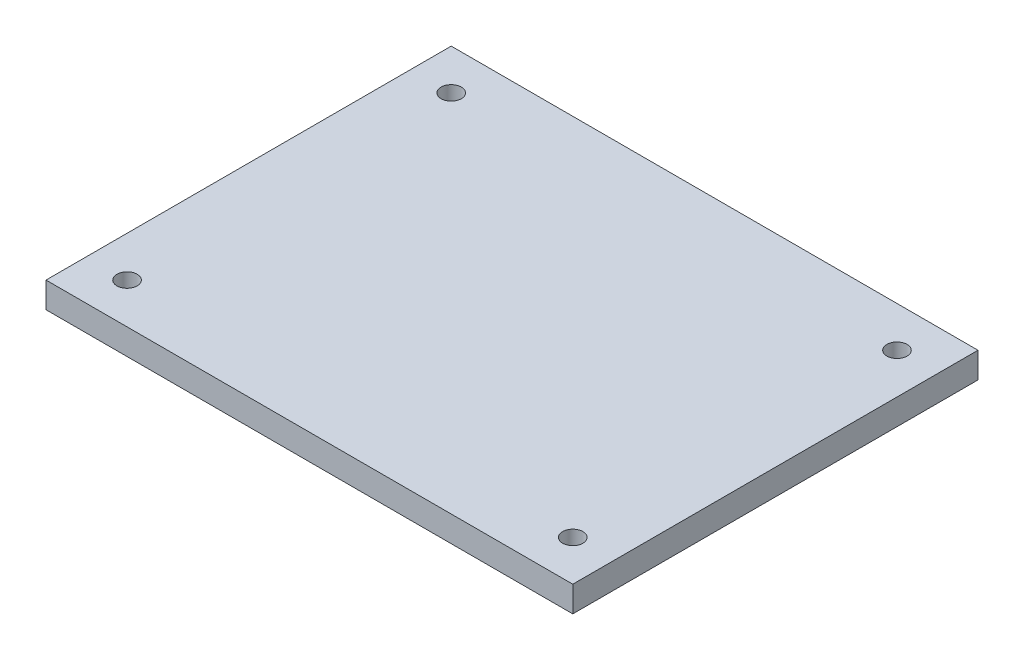
ISO-10303-21;
HEADER;
FILE_DESCRIPTION(('STEP AP214'),'2;1');
FILE_NAME('part.step','',(''),(''),'','','');
FILE_SCHEMA(('AUTOMOTIVE_DESIGN { 1 0 10303 214 1 1 1 1 }'));
ENDSEC;
DATA;
#1=APPLICATION_CONTEXT('core data for automotive mechanical design processes');
#2=APPLICATION_PROTOCOL_DEFINITION('international standard','automotive_design',2000,#1);
#3=PRODUCT_CONTEXT('',#1,'mechanical');
#4=PRODUCT('Part','Part','',(#3));
#5=PRODUCT_RELATED_PRODUCT_CATEGORY('part','',(#4));
#6=PRODUCT_DEFINITION_FORMATION('','',#4);
#7=PRODUCT_DEFINITION_CONTEXT('part definition',#1,'design');
#8=PRODUCT_DEFINITION('design','',#6,#7);
#9=PRODUCT_DEFINITION_SHAPE('','',#8);
#10=(LENGTH_UNIT() NAMED_UNIT(*) SI_UNIT(.MILLI.,.METRE.));
#11=(NAMED_UNIT(*) PLANE_ANGLE_UNIT() SI_UNIT($,.RADIAN.));
#12=(NAMED_UNIT(*) SI_UNIT($,.STERADIAN.) SOLID_ANGLE_UNIT());
#13=UNCERTAINTY_MEASURE_WITH_UNIT(LENGTH_MEASURE(1.E-05),#10,'distance_accuracy_value','');
#14=(GEOMETRIC_REPRESENTATION_CONTEXT(3) GLOBAL_UNCERTAINTY_ASSIGNED_CONTEXT((#13)) GLOBAL_UNIT_ASSIGNED_CONTEXT((#10,
#11,#12)) REPRESENTATION_CONTEXT('',''));
#15=CARTESIAN_POINT('',(0.,0.,0.));
#16=DIRECTION('',(0.,0.,1.));
#17=DIRECTION('',(1.,0.,0.));
#18=AXIS2_PLACEMENT_3D('',#15,#16,#17);
#19=CARTESIAN_POINT('',(0.,3.175,0.));
#20=DIRECTION('',(1.,0.,0.));
#21=DIRECTION('',(0.,0.,-1.));
#22=AXIS2_PLACEMENT_3D('',#19,#20,#21);
#23=PLANE('',#22);
#24=DIRECTION('',(0.,0.,1.));
#25=VECTOR('',#24,1.);
#26=CARTESIAN_POINT('',(0.,0.,0.));
#27=LINE('',#26,#25);
#28=CARTESIAN_POINT('',(0.,0.,-50.));
#29=VERTEX_POINT('',#28);
#30=CARTESIAN_POINT('',(0.,0.,0.));
#31=VERTEX_POINT('',#30);
#32=EDGE_CURVE('E101',#29,#31,#27,.T.);
#33=ORIENTED_EDGE('',*,*,#32,.T.);
#34=DIRECTION('',(0.,-1.,0.));
#35=VECTOR('',#34,1.);
#36=CARTESIAN_POINT('',(0.,3.175,0.));
#37=LINE('',#36,#35);
#38=CARTESIAN_POINT('',(0.,3.175,0.));
#39=VERTEX_POINT('',#38);
#40=EDGE_CURVE('E11',#39,#31,#37,.T.);
#41=ORIENTED_EDGE('',*,*,#40,.F.);
#42=DIRECTION('',(0.,0.,1.));
#43=VECTOR('',#42,1.);
#44=CARTESIAN_POINT('',(0.,3.175,0.));
#45=LINE('',#44,#43);
#46=CARTESIAN_POINT('',(0.,3.175,-50.));
#47=VERTEX_POINT('',#46);
#48=EDGE_CURVE('E88',#47,#39,#45,.T.);
#49=ORIENTED_EDGE('',*,*,#48,.F.);
#50=DIRECTION('',(0.,-1.,0.));
#51=VECTOR('',#50,1.);
#52=CARTESIAN_POINT('',(0.,3.175,-50.));
#53=LINE('',#52,#51);
#54=EDGE_CURVE('E97',#47,#29,#53,.T.);
#55=ORIENTED_EDGE('',*,*,#54,.T.);
#56=EDGE_LOOP('',(#33,#41,#49,#55));
#57=FACE_BOUND('',#56,.T.);
#58=ADVANCED_FACE('F35',(#57),#23,.F.);
#59=CARTESIAN_POINT('',(0.,3.175,0.));
#60=DIRECTION('',(0.,0.,-1.));
#61=DIRECTION('',(-1.,0.,0.));
#62=AXIS2_PLACEMENT_3D('',#59,#60,#61);
#63=PLANE('',#62);
#64=DIRECTION('',(1.,0.,0.));
#65=VECTOR('',#64,1.);
#66=CARTESIAN_POINT('',(0.,0.,0.));
#67=LINE('',#66,#65);
#68=CARTESIAN_POINT('',(65.,0.,0.));
#69=VERTEX_POINT('',#68);
#70=EDGE_CURVE('E92',#31,#69,#67,.T.);
#71=ORIENTED_EDGE('',*,*,#70,.T.);
#72=DIRECTION('',(0.,-1.,0.));
#73=VECTOR('',#72,1.);
#74=CARTESIAN_POINT('',(65.,3.175,0.));
#75=LINE('',#74,#73);
#76=CARTESIAN_POINT('',(65.,3.175,0.));
#77=VERTEX_POINT('',#76);
#78=EDGE_CURVE('E44',#77,#69,#75,.T.);
#79=ORIENTED_EDGE('',*,*,#78,.F.);
#80=DIRECTION('',(1.,0.,0.));
#81=VECTOR('',#80,1.);
#82=CARTESIAN_POINT('',(0.,3.175,0.));
#83=LINE('',#82,#81);
#84=EDGE_CURVE('E83',#39,#77,#83,.T.);
#85=ORIENTED_EDGE('',*,*,#84,.F.);
#86=ORIENTED_EDGE('',*,*,#40,.T.);
#87=EDGE_LOOP('',(#71,#79,#85,#86));
#88=FACE_BOUND('',#87,.T.);
#89=ADVANCED_FACE('F91',(#88),#63,.F.);
#90=CARTESIAN_POINT('',(65.,3.175,0.));
#91=DIRECTION('',(-1.,0.,0.));
#92=DIRECTION('',(0.,0.,1.));
#93=AXIS2_PLACEMENT_3D('',#90,#91,#92);
#94=PLANE('',#93);
#95=DIRECTION('',(0.,0.,-1.));
#96=VECTOR('',#95,1.);
#97=CARTESIAN_POINT('',(65.,0.,0.));
#98=LINE('',#97,#96);
#99=CARTESIAN_POINT('',(65.,0.,-50.));
#100=VERTEX_POINT('',#99);
#101=EDGE_CURVE('E70',#69,#100,#98,.T.);
#102=ORIENTED_EDGE('',*,*,#101,.T.);
#103=DIRECTION('',(0.,-1.,0.));
#104=VECTOR('',#103,1.);
#105=CARTESIAN_POINT('',(65.,3.175,-50.));
#106=LINE('',#105,#104);
#107=CARTESIAN_POINT('',(65.,3.175,-50.));
#108=VERTEX_POINT('',#107);
#109=EDGE_CURVE('E93',#108,#100,#106,.T.);
#110=ORIENTED_EDGE('',*,*,#109,.F.);
#111=DIRECTION('',(0.,0.,-1.));
#112=VECTOR('',#111,1.);
#113=CARTESIAN_POINT('',(65.,3.175,0.));
#114=LINE('',#113,#112);
#115=EDGE_CURVE('E86',#77,#108,#114,.T.);
#116=ORIENTED_EDGE('',*,*,#115,.F.);
#117=ORIENTED_EDGE('',*,*,#78,.T.);
#118=EDGE_LOOP('',(#102,#110,#116,#117));
#119=FACE_BOUND('',#118,.T.);
#120=ADVANCED_FACE('F95',(#119),#94,.F.);
#121=CARTESIAN_POINT('',(0.,3.175,-50.));
#122=DIRECTION('',(0.,0.,1.));
#123=DIRECTION('',(1.,0.,0.));
#124=AXIS2_PLACEMENT_3D('',#121,#122,#123);
#125=PLANE('',#124);
#126=DIRECTION('',(-1.,0.,0.));
#127=VECTOR('',#126,1.);
#128=CARTESIAN_POINT('',(0.,0.,-50.));
#129=LINE('',#128,#127);
#130=EDGE_CURVE('E76',#100,#29,#129,.T.);
#131=ORIENTED_EDGE('',*,*,#130,.T.);
#132=ORIENTED_EDGE('',*,*,#54,.F.);
#133=DIRECTION('',(-1.,0.,0.));
#134=VECTOR('',#133,1.);
#135=CARTESIAN_POINT('',(0.,3.175,-50.));
#136=LINE('',#135,#134);
#137=EDGE_CURVE('E53',#108,#47,#136,.T.);
#138=ORIENTED_EDGE('',*,*,#137,.F.);
#139=ORIENTED_EDGE('',*,*,#109,.T.);
#140=EDGE_LOOP('',(#131,#132,#138,#139));
#141=FACE_BOUND('',#140,.T.);
#142=ADVANCED_FACE('F144',(#141),#125,.F.);
#143=CARTESIAN_POINT('',(0.,3.175,-50.));
#144=DIRECTION('',(0.,-1.,0.));
#145=DIRECTION('',(0.,0.,-1.));
#146=AXIS2_PLACEMENT_3D('',#143,#144,#145);
#147=PLANE('',#146);
#148=CARTESIAN_POINT('',(4.99999999999997,3.175,-45.));
#149=DIRECTION('',(0.,1.,0.));
#150=DIRECTION('',(0.,0.,1.));
#151=AXIS2_PLACEMENT_3D('',#148,#149,#150);
#152=CIRCLE('',#151,1.24999999999999);
#153=CARTESIAN_POINT('',(4.99999999999997,3.175,-43.75));
#154=VERTEX_POINT('',#153);
#155=EDGE_CURVE('E123',#154,#154,#152,.T.);
#156=ORIENTED_EDGE('',*,*,#155,.F.);
#157=EDGE_LOOP('',(#156));
#158=FACE_BOUND('',#157,.T.);
#159=CARTESIAN_POINT('',(60.,3.175,-45.));
#160=DIRECTION('',(0.,1.,0.));
#161=DIRECTION('',(0.,0.,1.));
#162=AXIS2_PLACEMENT_3D('',#159,#160,#161);
#163=CIRCLE('',#162,1.24999999999999);
#164=CARTESIAN_POINT('',(60.,3.175,-43.75));
#165=VERTEX_POINT('',#164);
#166=EDGE_CURVE('E112',#165,#165,#163,.T.);
#167=ORIENTED_EDGE('',*,*,#166,.F.);
#168=EDGE_LOOP('',(#167));
#169=FACE_BOUND('',#168,.T.);
#170=CARTESIAN_POINT('',(60.,3.175,-5.));
#171=DIRECTION('',(0.,1.,0.));
#172=DIRECTION('',(0.,0.,1.));
#173=AXIS2_PLACEMENT_3D('',#170,#171,#172);
#174=CIRCLE('',#173,1.24999999999999);
#175=CARTESIAN_POINT('',(60.,3.175,-3.75000000000001));
#176=VERTEX_POINT('',#175);
#177=EDGE_CURVE('E111',#176,#176,#174,.T.);
#178=ORIENTED_EDGE('',*,*,#177,.F.);
#179=EDGE_LOOP('',(#178));
#180=FACE_BOUND('',#179,.T.);
#181=CARTESIAN_POINT('',(4.99999999999997,3.175,-5.));
#182=DIRECTION('',(0.,1.,0.));
#183=DIRECTION('',(0.,0.,1.));
#184=AXIS2_PLACEMENT_3D('',#181,#182,#183);
#185=CIRCLE('',#184,1.24999999999999);
#186=CARTESIAN_POINT('',(4.99999999999997,3.175,-3.75000000000001));
#187=VERTEX_POINT('',#186);
#188=EDGE_CURVE('E128',#187,#187,#185,.T.);
#189=ORIENTED_EDGE('',*,*,#188,.F.);
#190=EDGE_LOOP('',(#189));
#191=FACE_BOUND('',#190,.T.);
#192=ORIENTED_EDGE('',*,*,#48,.T.);
#193=ORIENTED_EDGE('',*,*,#84,.T.);
#194=ORIENTED_EDGE('',*,*,#115,.T.);
#195=ORIENTED_EDGE('',*,*,#137,.T.);
#196=EDGE_LOOP('',(#192,#193,#194,#195));
#197=FACE_BOUND('',#196,.T.);
#198=ADVANCED_FACE('F84',(#158,#169,#180,#191,#197),#147,.F.);
#199=CARTESIAN_POINT('',(0.,0.,-50.));
#200=DIRECTION('',(0.,-1.,0.));
#201=DIRECTION('',(0.,0.,-1.));
#202=AXIS2_PLACEMENT_3D('',#199,#200,#201);
#203=PLANE('',#202);
#204=CARTESIAN_POINT('',(4.99999999999997,0.,-45.));
#205=DIRECTION('',(0.,-1.,0.));
#206=DIRECTION('',(0.,0.,-1.));
#207=AXIS2_PLACEMENT_3D('',#204,#205,#206);
#208=CIRCLE('',#207,1.24999999999999);
#209=CARTESIAN_POINT('',(4.99999999999997,0.,-46.25));
#210=VERTEX_POINT('',#209);
#211=EDGE_CURVE('E38',#210,#210,#208,.T.);
#212=ORIENTED_EDGE('',*,*,#211,.F.);
#213=EDGE_LOOP('',(#212));
#214=FACE_BOUND('',#213,.T.);
#215=CARTESIAN_POINT('',(60.,0.,-45.));
#216=DIRECTION('',(0.,-1.,0.));
#217=DIRECTION('',(0.,0.,-1.));
#218=AXIS2_PLACEMENT_3D('',#215,#216,#217);
#219=CIRCLE('',#218,1.24999999999999);
#220=CARTESIAN_POINT('',(60.,0.,-46.25));
#221=VERTEX_POINT('',#220);
#222=EDGE_CURVE('E109',#221,#221,#219,.T.);
#223=ORIENTED_EDGE('',*,*,#222,.F.);
#224=EDGE_LOOP('',(#223));
#225=FACE_BOUND('',#224,.T.);
#226=CARTESIAN_POINT('',(60.,0.,-5.));
#227=DIRECTION('',(0.,-1.,0.));
#228=DIRECTION('',(0.,0.,-1.));
#229=AXIS2_PLACEMENT_3D('',#226,#227,#228);
#230=CIRCLE('',#229,1.24999999999999);
#231=CARTESIAN_POINT('',(60.,0.,-6.24999999999999));
#232=VERTEX_POINT('',#231);
#233=EDGE_CURVE('E116',#232,#232,#230,.T.);
#234=ORIENTED_EDGE('',*,*,#233,.F.);
#235=EDGE_LOOP('',(#234));
#236=FACE_BOUND('',#235,.T.);
#237=CARTESIAN_POINT('',(4.99999999999997,0.,-5.));
#238=DIRECTION('',(0.,-1.,0.));
#239=DIRECTION('',(0.,0.,-1.));
#240=AXIS2_PLACEMENT_3D('',#237,#238,#239);
#241=CIRCLE('',#240,1.24999999999999);
#242=CARTESIAN_POINT('',(4.99999999999997,0.,-6.24999999999999));
#243=VERTEX_POINT('',#242);
#244=EDGE_CURVE('E104',#243,#243,#241,.T.);
#245=ORIENTED_EDGE('',*,*,#244,.F.);
#246=EDGE_LOOP('',(#245));
#247=FACE_BOUND('',#246,.T.);
#248=ORIENTED_EDGE('',*,*,#32,.F.);
#249=ORIENTED_EDGE('',*,*,#130,.F.);
#250=ORIENTED_EDGE('',*,*,#101,.F.);
#251=ORIENTED_EDGE('',*,*,#70,.F.);
#252=EDGE_LOOP('',(#248,#249,#250,#251));
#253=FACE_BOUND('',#252,.T.);
#254=ADVANCED_FACE('F137',(#214,#225,#236,#247,#253),#203,.T.);
#255=CARTESIAN_POINT('',(4.99999999999997,3.175,-5.));
#256=DIRECTION('',(0.,1.,0.));
#257=DIRECTION('',(0.,0.,1.));
#258=AXIS2_PLACEMENT_3D('',#255,#256,#257);
#259=CYLINDRICAL_SURFACE('',#258,1.24999999999999);
#260=ORIENTED_EDGE('',*,*,#244,.T.);
#261=EDGE_LOOP('',(#260));
#262=FACE_BOUND('',#261,.T.);
#263=ORIENTED_EDGE('',*,*,#188,.T.);
#264=EDGE_LOOP('',(#263));
#265=FACE_BOUND('',#264,.T.);
#266=ADVANCED_FACE('F134',(#262,#265),#259,.F.);
#267=CARTESIAN_POINT('',(60.,3.175,-5.));
#268=DIRECTION('',(0.,1.,0.));
#269=DIRECTION('',(0.,0.,1.));
#270=AXIS2_PLACEMENT_3D('',#267,#268,#269);
#271=CYLINDRICAL_SURFACE('',#270,1.24999999999999);
#272=ORIENTED_EDGE('',*,*,#233,.T.);
#273=EDGE_LOOP('',(#272));
#274=FACE_BOUND('',#273,.T.);
#275=ORIENTED_EDGE('',*,*,#177,.T.);
#276=EDGE_LOOP('',(#275));
#277=FACE_BOUND('',#276,.T.);
#278=ADVANCED_FACE('F190',(#274,#277),#271,.F.);
#279=CARTESIAN_POINT('',(60.,3.175,-45.));
#280=DIRECTION('',(0.,1.,0.));
#281=DIRECTION('',(0.,0.,1.));
#282=AXIS2_PLACEMENT_3D('',#279,#280,#281);
#283=CYLINDRICAL_SURFACE('',#282,1.24999999999999);
#284=ORIENTED_EDGE('',*,*,#222,.T.);
#285=EDGE_LOOP('',(#284));
#286=FACE_BOUND('',#285,.T.);
#287=ORIENTED_EDGE('',*,*,#166,.T.);
#288=EDGE_LOOP('',(#287));
#289=FACE_BOUND('',#288,.T.);
#290=ADVANCED_FACE('F200',(#286,#289),#283,.F.);
#291=CARTESIAN_POINT('',(4.99999999999997,3.175,-45.));
#292=DIRECTION('',(0.,1.,0.));
#293=DIRECTION('',(0.,0.,1.));
#294=AXIS2_PLACEMENT_3D('',#291,#292,#293);
#295=CYLINDRICAL_SURFACE('',#294,1.24999999999999);
#296=ORIENTED_EDGE('',*,*,#211,.T.);
#297=EDGE_LOOP('',(#296));
#298=FACE_BOUND('',#297,.T.);
#299=ORIENTED_EDGE('',*,*,#155,.T.);
#300=EDGE_LOOP('',(#299));
#301=FACE_BOUND('',#300,.T.);
#302=ADVANCED_FACE('F211',(#298,#301),#295,.F.);
#303=CLOSED_SHELL('',(#58,#89,#120,#142,#198,#254,#266,#278,#290,#302));
#304=MANIFOLD_SOLID_BREP('B2',#303);
#305=ADVANCED_BREP_SHAPE_REPRESENTATION('',(#18,#304),#14);
#306=SHAPE_DEFINITION_REPRESENTATION(#9,#305);
ENDSEC;
END-ISO-10303-21;
